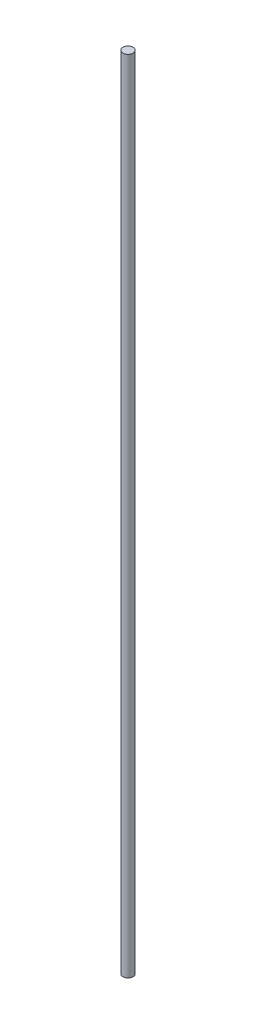
ISO-10303-21;
HEADER;
FILE_DESCRIPTION(('STEP AP214'),'2;1');
FILE_NAME('part.step','',(''),(''),'','','');
FILE_SCHEMA(('AUTOMOTIVE_DESIGN { 1 0 10303 214 1 1 1 1 }'));
ENDSEC;
DATA;
#1=APPLICATION_CONTEXT('core data for automotive mechanical design processes');
#2=APPLICATION_PROTOCOL_DEFINITION('international standard','automotive_design',2000,#1);
#3=PRODUCT_CONTEXT('',#1,'mechanical');
#4=PRODUCT('Part','Part','',(#3));
#5=PRODUCT_RELATED_PRODUCT_CATEGORY('part','',(#4));
#6=PRODUCT_DEFINITION_FORMATION('','',#4);
#7=PRODUCT_DEFINITION_CONTEXT('part definition',#1,'design');
#8=PRODUCT_DEFINITION('design','',#6,#7);
#9=PRODUCT_DEFINITION_SHAPE('','',#8);
#10=(LENGTH_UNIT() NAMED_UNIT(*) SI_UNIT(.MILLI.,.METRE.));
#11=(NAMED_UNIT(*) PLANE_ANGLE_UNIT() SI_UNIT($,.RADIAN.));
#12=(NAMED_UNIT(*) SI_UNIT($,.STERADIAN.) SOLID_ANGLE_UNIT());
#13=UNCERTAINTY_MEASURE_WITH_UNIT(LENGTH_MEASURE(1.E-05),#10,'distance_accuracy_value','');
#14=(GEOMETRIC_REPRESENTATION_CONTEXT(3) GLOBAL_UNCERTAINTY_ASSIGNED_CONTEXT((#13)) GLOBAL_UNIT_ASSIGNED_CONTEXT((#10,
#11,#12)) REPRESENTATION_CONTEXT('',''));
#15=CARTESIAN_POINT('',(0.,0.,0.));
#16=DIRECTION('',(0.,0.,1.));
#17=DIRECTION('',(1.,0.,0.));
#18=AXIS2_PLACEMENT_3D('',#15,#16,#17);
#19=CARTESIAN_POINT('',(0.,-195.,0.));
#20=DIRECTION('',(0.,1.,0.));
#21=DIRECTION('',(0.,0.,1.));
#22=AXIS2_PLACEMENT_3D('',#19,#20,#21);
#23=CYLINDRICAL_SURFACE('',#22,2.5);
#24=CARTESIAN_POINT('',(0.,-195.,0.));
#25=DIRECTION('',(0.,1.,0.));
#26=DIRECTION('',(0.,0.,1.));
#27=AXIS2_PLACEMENT_3D('',#24,#25,#26);
#28=CIRCLE('',#27,2.5);
#29=CARTESIAN_POINT('',(0.,-195.,2.5));
#30=VERTEX_POINT('',#29);
#31=EDGE_CURVE('E10',#30,#30,#28,.T.);
#32=ORIENTED_EDGE('',*,*,#31,.T.);
#33=EDGE_LOOP('',(#32));
#34=FACE_BOUND('',#33,.T.);
#35=CARTESIAN_POINT('',(0.,195.,0.));
#36=DIRECTION('',(0.,1.,0.));
#37=DIRECTION('',(0.,0.,1.));
#38=AXIS2_PLACEMENT_3D('',#35,#36,#37);
#39=CIRCLE('',#38,2.5);
#40=CARTESIAN_POINT('',(0.,195.,2.5));
#41=VERTEX_POINT('',#40);
#42=EDGE_CURVE('E50',#41,#41,#39,.T.);
#43=ORIENTED_EDGE('',*,*,#42,.F.);
#44=EDGE_LOOP('',(#43));
#45=FACE_BOUND('',#44,.T.);
#46=ADVANCED_FACE('F43',(#34,#45),#23,.T.);
#47=CARTESIAN_POINT('',(0.,-195.,0.));
#48=DIRECTION('',(0.,1.,0.));
#49=DIRECTION('',(0.,0.,1.));
#50=AXIS2_PLACEMENT_3D('',#47,#48,#49);
#51=PLANE('',#50);
#52=ORIENTED_EDGE('',*,*,#31,.F.);
#53=EDGE_LOOP('',(#52));
#54=FACE_BOUND('',#53,.T.);
#55=ADVANCED_FACE('F60',(#54),#51,.F.);
#56=CARTESIAN_POINT('',(0.,195.,0.));
#57=DIRECTION('',(0.,1.,0.));
#58=DIRECTION('',(0.,0.,1.));
#59=AXIS2_PLACEMENT_3D('',#56,#57,#58);
#60=PLANE('',#59);
#61=ORIENTED_EDGE('',*,*,#42,.T.);
#62=EDGE_LOOP('',(#61));
#63=FACE_BOUND('',#62,.T.);
#64=ADVANCED_FACE('F57',(#63),#60,.T.);
#65=CLOSED_SHELL('',(#46,#55,#64));
#66=MANIFOLD_SOLID_BREP('B2',#65);
#67=ADVANCED_BREP_SHAPE_REPRESENTATION('',(#18,#66),#14);
#68=SHAPE_DEFINITION_REPRESENTATION(#9,#67);
ENDSEC;
END-ISO-10303-21;
